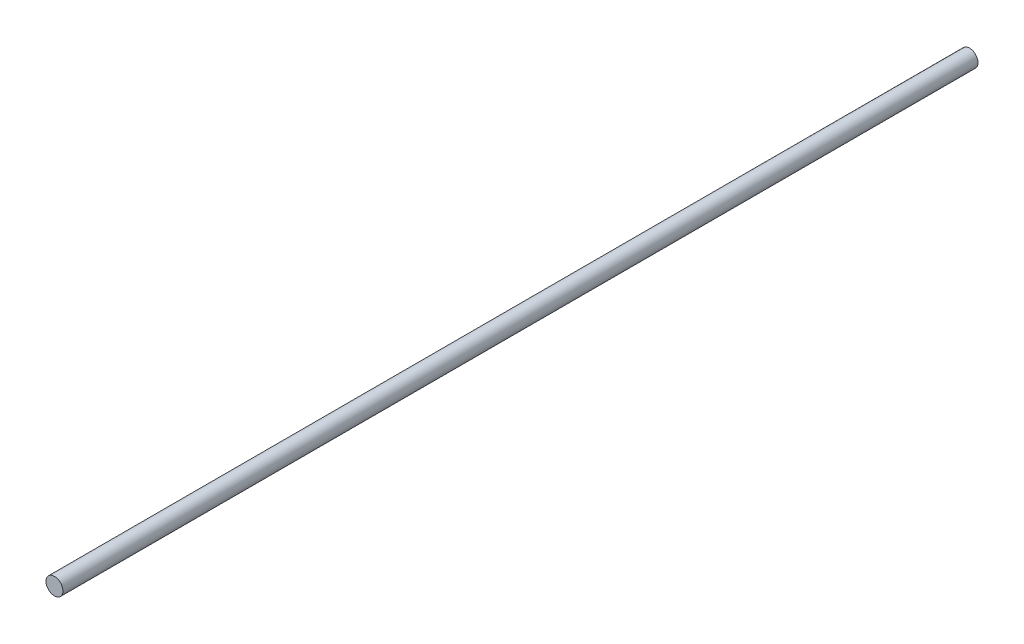
ISO-10303-21;
HEADER;
FILE_DESCRIPTION(('STEP AP214'),'2;1');
FILE_NAME('part.step','',(''),(''),'','','');
FILE_SCHEMA(('AUTOMOTIVE_DESIGN { 1 0 10303 214 1 1 1 1 }'));
ENDSEC;
DATA;
#1=APPLICATION_CONTEXT('core data for automotive mechanical design processes');
#2=APPLICATION_PROTOCOL_DEFINITION('international standard','automotive_design',2000,#1);
#3=PRODUCT_CONTEXT('',#1,'mechanical');
#4=PRODUCT('Part','Part','',(#3));
#5=PRODUCT_RELATED_PRODUCT_CATEGORY('part','',(#4));
#6=PRODUCT_DEFINITION_FORMATION('','',#4);
#7=PRODUCT_DEFINITION_CONTEXT('part definition',#1,'design');
#8=PRODUCT_DEFINITION('design','',#6,#7);
#9=PRODUCT_DEFINITION_SHAPE('','',#8);
#10=(LENGTH_UNIT() NAMED_UNIT(*) SI_UNIT(.MILLI.,.METRE.));
#11=(NAMED_UNIT(*) PLANE_ANGLE_UNIT() SI_UNIT($,.RADIAN.));
#12=(NAMED_UNIT(*) SI_UNIT($,.STERADIAN.) SOLID_ANGLE_UNIT());
#13=UNCERTAINTY_MEASURE_WITH_UNIT(LENGTH_MEASURE(1.E-05),#10,'distance_accuracy_value','');
#14=(GEOMETRIC_REPRESENTATION_CONTEXT(3) GLOBAL_UNCERTAINTY_ASSIGNED_CONTEXT((#13)) GLOBAL_UNIT_ASSIGNED_CONTEXT((#10,
#11,#12)) REPRESENTATION_CONTEXT('',''));
#15=CARTESIAN_POINT('',(0.,0.,0.));
#16=DIRECTION('',(0.,0.,1.));
#17=DIRECTION('',(1.,0.,0.));
#18=AXIS2_PLACEMENT_3D('',#15,#16,#17);
#19=CARTESIAN_POINT('',(0.,0.,108.));
#20=DIRECTION('',(0.,0.,-1.));
#21=DIRECTION('',(-1.,0.,0.));
#22=AXIS2_PLACEMENT_3D('',#19,#20,#21);
#23=CYLINDRICAL_SURFACE('',#22,2.);
#24=CARTESIAN_POINT('',(0.,0.,108.));
#25=DIRECTION('',(0.,0.,1.));
#26=DIRECTION('',(1.,0.,0.));
#27=AXIS2_PLACEMENT_3D('',#24,#25,#26);
#28=CIRCLE('',#27,2.);
#29=CARTESIAN_POINT('',(2.,0.,108.));
#30=VERTEX_POINT('',#29);
#31=EDGE_CURVE('E10',#30,#30,#28,.T.);
#32=ORIENTED_EDGE('',*,*,#31,.F.);
#33=EDGE_LOOP('',(#32));
#34=FACE_BOUND('',#33,.T.);
#35=CARTESIAN_POINT('',(0.,0.,-108.));
#36=DIRECTION('',(0.,0.,1.));
#37=DIRECTION('',(1.,0.,0.));
#38=AXIS2_PLACEMENT_3D('',#35,#36,#37);
#39=CIRCLE('',#38,2.);
#40=CARTESIAN_POINT('',(2.,0.,-108.));
#41=VERTEX_POINT('',#40);
#42=EDGE_CURVE('E34',#41,#41,#39,.T.);
#43=ORIENTED_EDGE('',*,*,#42,.T.);
#44=EDGE_LOOP('',(#43));
#45=FACE_BOUND('',#44,.T.);
#46=ADVANCED_FACE('F31',(#34,#45),#23,.T.);
#47=CARTESIAN_POINT('',(0.,0.,108.));
#48=DIRECTION('',(0.,0.,1.));
#49=DIRECTION('',(1.,0.,0.));
#50=AXIS2_PLACEMENT_3D('',#47,#48,#49);
#51=PLANE('',#50);
#52=ORIENTED_EDGE('',*,*,#31,.T.);
#53=EDGE_LOOP('',(#52));
#54=FACE_BOUND('',#53,.T.);
#55=ADVANCED_FACE('F46',(#54),#51,.T.);
#56=CARTESIAN_POINT('',(0.,0.,-108.));
#57=DIRECTION('',(0.,0.,1.));
#58=DIRECTION('',(1.,0.,0.));
#59=AXIS2_PLACEMENT_3D('',#56,#57,#58);
#60=PLANE('',#59);
#61=ORIENTED_EDGE('',*,*,#42,.F.);
#62=EDGE_LOOP('',(#61));
#63=FACE_BOUND('',#62,.T.);
#64=ADVANCED_FACE('F44',(#63),#60,.F.);
#65=CLOSED_SHELL('',(#46,#55,#64));
#66=MANIFOLD_SOLID_BREP('B2',#65);
#67=ADVANCED_BREP_SHAPE_REPRESENTATION('',(#18,#66),#14);
#68=SHAPE_DEFINITION_REPRESENTATION(#9,#67);
ENDSEC;
END-ISO-10303-21;
